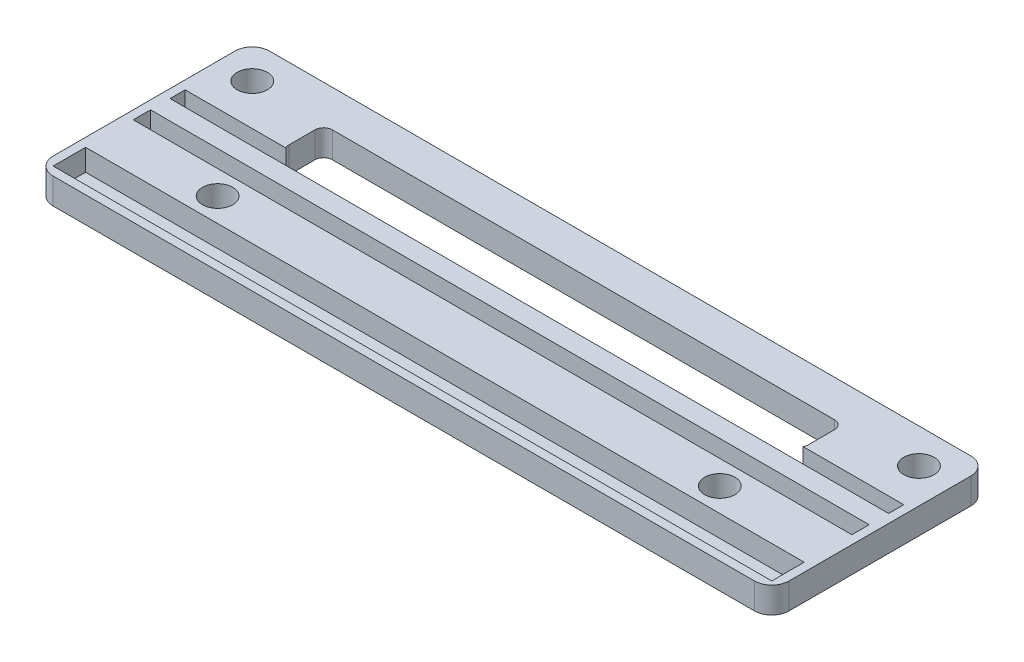
ISO-10303-21;
HEADER;
FILE_DESCRIPTION(('STEP AP214'),'2;1');
FILE_NAME('part.step','',(''),(''),'','','');
FILE_SCHEMA(('AUTOMOTIVE_DESIGN { 1 0 10303 214 1 1 1 1 }'));
ENDSEC;
DATA;
#1=APPLICATION_CONTEXT('core data for automotive mechanical design processes');
#2=APPLICATION_PROTOCOL_DEFINITION('international standard','automotive_design',2000,#1);
#3=PRODUCT_CONTEXT('',#1,'mechanical');
#4=PRODUCT('Part','Part','',(#3));
#5=PRODUCT_RELATED_PRODUCT_CATEGORY('part','',(#4));
#6=PRODUCT_DEFINITION_FORMATION('','',#4);
#7=PRODUCT_DEFINITION_CONTEXT('part definition',#1,'design');
#8=PRODUCT_DEFINITION('design','',#6,#7);
#9=PRODUCT_DEFINITION_SHAPE('','',#8);
#10=(LENGTH_UNIT() NAMED_UNIT(*) SI_UNIT(.MILLI.,.METRE.));
#11=(NAMED_UNIT(*) PLANE_ANGLE_UNIT() SI_UNIT($,.RADIAN.));
#12=(NAMED_UNIT(*) SI_UNIT($,.STERADIAN.) SOLID_ANGLE_UNIT());
#13=UNCERTAINTY_MEASURE_WITH_UNIT(LENGTH_MEASURE(1.E-05),#10,'distance_accuracy_value','');
#14=(GEOMETRIC_REPRESENTATION_CONTEXT(3) GLOBAL_UNCERTAINTY_ASSIGNED_CONTEXT((#13)) GLOBAL_UNIT_ASSIGNED_CONTEXT((#10,
#11,#12)) REPRESENTATION_CONTEXT('',''));
#15=CARTESIAN_POINT('',(0.,0.,0.));
#16=DIRECTION('',(0.,0.,1.));
#17=DIRECTION('',(1.,0.,0.));
#18=AXIS2_PLACEMENT_3D('',#15,#16,#17);
#19=CARTESIAN_POINT('',(-41.5,0.5,-3.75));
#20=DIRECTION('',(0.,0.,-1.));
#21=DIRECTION('',(-1.,0.,0.));
#22=AXIS2_PLACEMENT_3D('',#19,#20,#21);
#23=PLANE('',#22);
#24=DIRECTION('',(-1.,0.,0.));
#25=VECTOR('',#24,1.);
#26=CARTESIAN_POINT('',(-41.5,0.5,-3.75));
#27=LINE('',#26,#25);
#28=CARTESIAN_POINT('',(-29.8660254037844,0.5,-3.75));
#29=VERTEX_POINT('',#28);
#30=CARTESIAN_POINT('',(-41.5,0.5,-3.75));
#31=VERTEX_POINT('',#30);
#32=EDGE_CURVE('E353',#29,#31,#27,.T.);
#33=ORIENTED_EDGE('',*,*,#32,.F.);
#34=DIRECTION('',(0.,-1.,0.));
#35=VECTOR('',#34,1.);
#36=CARTESIAN_POINT('',(-29.8660254037844,0.5,-3.75));
#37=LINE('',#36,#35);
#38=CARTESIAN_POINT('',(-29.8660254037844,3.,-3.75));
#39=VERTEX_POINT('',#38);
#40=EDGE_CURVE('E475',#29,#39,#37,.F.);
#41=ORIENTED_EDGE('',*,*,#40,.T.);
#42=DIRECTION('',(-1.,0.,0.));
#43=VECTOR('',#42,1.);
#44=CARTESIAN_POINT('',(-41.5,3.,-3.75));
#45=LINE('',#44,#43);
#46=CARTESIAN_POINT('',(-41.5,3.,-3.75));
#47=VERTEX_POINT('',#46);
#48=EDGE_CURVE('E370',#39,#47,#45,.T.);
#49=ORIENTED_EDGE('',*,*,#48,.T.);
#50=DIRECTION('',(0.,1.,0.));
#51=VECTOR('',#50,1.);
#52=CARTESIAN_POINT('',(-41.5,0.5,-3.75));
#53=LINE('',#52,#51);
#54=EDGE_CURVE('E318',#31,#47,#53,.T.);
#55=ORIENTED_EDGE('',*,*,#54,.F.);
#56=EDGE_LOOP('',(#33,#41,#49,#55));
#57=FACE_BOUND('',#56,.T.);
#58=ADVANCED_FACE('F38',(#57),#23,.F.);
#59=CARTESIAN_POINT('',(-42.5,3.,-12.5));
#60=DIRECTION('',(1.,0.,0.));
#61=DIRECTION('',(0.,0.,-1.));
#62=AXIS2_PLACEMENT_3D('',#59,#60,#61);
#63=PLANE('',#62);
#64=DIRECTION('',(0.,0.,1.));
#65=VECTOR('',#64,1.);
#66=CARTESIAN_POINT('',(-42.5,0.,-12.5));
#67=LINE('',#66,#65);
#68=CARTESIAN_POINT('',(-42.5,0.,-10.5));
#69=VERTEX_POINT('',#68);
#70=CARTESIAN_POINT('',(-42.5,0.,10.5));
#71=VERTEX_POINT('',#70);
#72=EDGE_CURVE('E290',#69,#71,#67,.T.);
#73=ORIENTED_EDGE('',*,*,#72,.T.);
#74=DIRECTION('',(0.,-1.,0.));
#75=VECTOR('',#74,1.);
#76=CARTESIAN_POINT('',(-42.5,3.,10.5));
#77=LINE('',#76,#75);
#78=CARTESIAN_POINT('',(-42.5,3.,10.5));
#79=VERTEX_POINT('',#78);
#80=EDGE_CURVE('E11',#71,#79,#77,.F.);
#81=ORIENTED_EDGE('',*,*,#80,.T.);
#82=DIRECTION('',(0.,0.,1.));
#83=VECTOR('',#82,1.);
#84=CARTESIAN_POINT('',(-42.5,3.,-12.5));
#85=LINE('',#84,#83);
#86=CARTESIAN_POINT('',(-42.5,3.,-10.5));
#87=VERTEX_POINT('',#86);
#88=EDGE_CURVE('E385',#87,#79,#85,.T.);
#89=ORIENTED_EDGE('',*,*,#88,.F.);
#90=DIRECTION('',(0.,-1.,0.));
#91=VECTOR('',#90,1.);
#92=CARTESIAN_POINT('',(-42.5,3.,-10.5));
#93=LINE('',#92,#91);
#94=EDGE_CURVE('E47',#87,#69,#93,.T.);
#95=ORIENTED_EDGE('',*,*,#94,.T.);
#96=EDGE_LOOP('',(#73,#81,#89,#95));
#97=FACE_BOUND('',#96,.T.);
#98=ADVANCED_FACE('F533',(#97),#63,.F.);
#99=CARTESIAN_POINT('',(-42.5,3.,12.5));
#100=DIRECTION('',(0.,0.,-1.));
#101=DIRECTION('',(-1.,0.,0.));
#102=AXIS2_PLACEMENT_3D('',#99,#100,#101);
#103=PLANE('',#102);
#104=DIRECTION('',(1.,0.,0.));
#105=VECTOR('',#104,1.);
#106=CARTESIAN_POINT('',(-42.5,0.,12.5));
#107=LINE('',#106,#105);
#108=CARTESIAN_POINT('',(-40.5,0.,12.5));
#109=VERTEX_POINT('',#108);
#110=CARTESIAN_POINT('',(40.5,0.,12.5));
#111=VERTEX_POINT('',#110);
#112=EDGE_CURVE('E404',#109,#111,#107,.T.);
#113=ORIENTED_EDGE('',*,*,#112,.T.);
#114=DIRECTION('',(0.,-1.,0.));
#115=VECTOR('',#114,1.);
#116=CARTESIAN_POINT('',(40.5,3.,12.5));
#117=LINE('',#116,#115);
#118=CARTESIAN_POINT('',(40.5,3.,12.5));
#119=VERTEX_POINT('',#118);
#120=EDGE_CURVE('E54',#111,#119,#117,.F.);
#121=ORIENTED_EDGE('',*,*,#120,.T.);
#122=DIRECTION('',(1.,0.,0.));
#123=VECTOR('',#122,1.);
#124=CARTESIAN_POINT('',(-42.5,3.,12.5));
#125=LINE('',#124,#123);
#126=CARTESIAN_POINT('',(-40.5,3.,12.5));
#127=VERTEX_POINT('',#126);
#128=EDGE_CURVE('E388',#127,#119,#125,.T.);
#129=ORIENTED_EDGE('',*,*,#128,.F.);
#130=DIRECTION('',(0.,-1.,0.));
#131=VECTOR('',#130,1.);
#132=CARTESIAN_POINT('',(-40.5,3.,12.5));
#133=LINE('',#132,#131);
#134=EDGE_CURVE('E522',#127,#109,#133,.T.);
#135=ORIENTED_EDGE('',*,*,#134,.T.);
#136=EDGE_LOOP('',(#113,#121,#129,#135));
#137=FACE_BOUND('',#136,.T.);
#138=ADVANCED_FACE('F544',(#137),#103,.F.);
#139=CARTESIAN_POINT('',(42.5,3.,-12.5));
#140=DIRECTION('',(-1.,0.,0.));
#141=DIRECTION('',(0.,0.,1.));
#142=AXIS2_PLACEMENT_3D('',#139,#140,#141);
#143=PLANE('',#142);
#144=DIRECTION('',(0.,0.,-1.));
#145=VECTOR('',#144,1.);
#146=CARTESIAN_POINT('',(42.5,0.,-12.5));
#147=LINE('',#146,#145);
#148=CARTESIAN_POINT('',(42.5,0.,10.5));
#149=VERTEX_POINT('',#148);
#150=CARTESIAN_POINT('',(42.5,0.,-10.5));
#151=VERTEX_POINT('',#150);
#152=EDGE_CURVE('E407',#149,#151,#147,.T.);
#153=ORIENTED_EDGE('',*,*,#152,.T.);
#154=DIRECTION('',(0.,-1.,0.));
#155=VECTOR('',#154,1.);
#156=CARTESIAN_POINT('',(42.5,3.,-10.5));
#157=LINE('',#156,#155);
#158=CARTESIAN_POINT('',(42.5,3.,-10.5));
#159=VERTEX_POINT('',#158);
#160=EDGE_CURVE('E508',#151,#159,#157,.F.);
#161=ORIENTED_EDGE('',*,*,#160,.T.);
#162=DIRECTION('',(0.,0.,-1.));
#163=VECTOR('',#162,1.);
#164=CARTESIAN_POINT('',(42.5,3.,-12.5));
#165=LINE('',#164,#163);
#166=CARTESIAN_POINT('',(42.5,3.,10.5));
#167=VERTEX_POINT('',#166);
#168=EDGE_CURVE('E392',#167,#159,#165,.T.);
#169=ORIENTED_EDGE('',*,*,#168,.F.);
#170=DIRECTION('',(0.,-1.,0.));
#171=VECTOR('',#170,1.);
#172=CARTESIAN_POINT('',(42.5,3.,10.5));
#173=LINE('',#172,#171);
#174=EDGE_CURVE('E504',#167,#149,#173,.T.);
#175=ORIENTED_EDGE('',*,*,#174,.T.);
#176=EDGE_LOOP('',(#153,#161,#169,#175));
#177=FACE_BOUND('',#176,.T.);
#178=ADVANCED_FACE('F553',(#177),#143,.F.);
#179=CARTESIAN_POINT('',(-42.5,3.,-12.5));
#180=DIRECTION('',(0.,0.,1.));
#181=DIRECTION('',(1.,0.,0.));
#182=AXIS2_PLACEMENT_3D('',#179,#180,#181);
#183=PLANE('',#182);
#184=DIRECTION('',(-1.,0.,0.));
#185=VECTOR('',#184,1.);
#186=CARTESIAN_POINT('',(-42.5,3.,-12.5));
#187=LINE('',#186,#185);
#188=CARTESIAN_POINT('',(40.5,3.,-12.5));
#189=VERTEX_POINT('',#188);
#190=CARTESIAN_POINT('',(-40.5,3.,-12.5));
#191=VERTEX_POINT('',#190);
#192=EDGE_CURVE('E396',#189,#191,#187,.T.);
#193=ORIENTED_EDGE('',*,*,#192,.F.);
#194=DIRECTION('',(0.,-1.,0.));
#195=VECTOR('',#194,1.);
#196=CARTESIAN_POINT('',(40.5,3.,-12.5));
#197=LINE('',#196,#195);
#198=CARTESIAN_POINT('',(40.5,0.,-12.5));
#199=VERTEX_POINT('',#198);
#200=EDGE_CURVE('E488',#189,#199,#197,.T.);
#201=ORIENTED_EDGE('',*,*,#200,.T.);
#202=DIRECTION('',(-1.,0.,0.));
#203=VECTOR('',#202,1.);
#204=CARTESIAN_POINT('',(-42.5,0.,-12.5));
#205=LINE('',#204,#203);
#206=CARTESIAN_POINT('',(-40.5,0.,-12.5));
#207=VERTEX_POINT('',#206);
#208=EDGE_CURVE('E389',#199,#207,#205,.T.);
#209=ORIENTED_EDGE('',*,*,#208,.T.);
#210=DIRECTION('',(0.,-1.,0.));
#211=VECTOR('',#210,1.);
#212=CARTESIAN_POINT('',(-40.5,3.,-12.5));
#213=LINE('',#212,#211);
#214=EDGE_CURVE('E485',#207,#191,#213,.F.);
#215=ORIENTED_EDGE('',*,*,#214,.T.);
#216=EDGE_LOOP('',(#193,#201,#209,#215));
#217=FACE_BOUND('',#216,.T.);
#218=ADVANCED_FACE('F561',(#217),#183,.F.);
#219=CARTESIAN_POINT('',(0.,3.,0.));
#220=DIRECTION('',(0.,1.,0.));
#221=DIRECTION('',(0.,0.,1.));
#222=AXIS2_PLACEMENT_3D('',#219,#220,#221);
#223=PLANE('',#222);
#224=DIRECTION('',(0.,0.,1.));
#225=VECTOR('',#224,1.);
#226=CARTESIAN_POINT('',(-30.,3.,-8.25000000000003));
#227=LINE('',#226,#225);
#228=CARTESIAN_POINT('',(-30.,3.,-7.25000000000003));
#229=VERTEX_POINT('',#228);
#230=CARTESIAN_POINT('',(-30.,3.,-4.25000000000001));
#231=VERTEX_POINT('',#230);
#232=EDGE_CURVE('E638',#229,#231,#227,.T.);
#233=ORIENTED_EDGE('',*,*,#232,.F.);
#234=CARTESIAN_POINT('',(-29.,3.,-7.25000000000003));
#235=DIRECTION('',(0.,1.,0.));
#236=DIRECTION('',(0.,0.,1.));
#237=AXIS2_PLACEMENT_3D('',#234,#235,#236);
#238=CIRCLE('',#237,1.);
#239=CARTESIAN_POINT('',(-29.,3.,-8.25000000000003));
#240=VERTEX_POINT('',#239);
#241=EDGE_CURVE('E465',#229,#240,#238,.F.);
#242=ORIENTED_EDGE('',*,*,#241,.T.);
#243=DIRECTION('',(-1.,0.,0.));
#244=VECTOR('',#243,1.);
#245=CARTESIAN_POINT('',(-30.,3.,-8.25000000000003));
#246=LINE('',#245,#244);
#247=CARTESIAN_POINT('',(29.,3.,-8.25000000000003));
#248=VERTEX_POINT('',#247);
#249=EDGE_CURVE('E645',#248,#240,#246,.T.);
#250=ORIENTED_EDGE('',*,*,#249,.F.);
#251=CARTESIAN_POINT('',(29.,3.,-7.25000000000003));
#252=DIRECTION('',(0.,1.,0.));
#253=DIRECTION('',(0.,0.,1.));
#254=AXIS2_PLACEMENT_3D('',#251,#252,#253);
#255=CIRCLE('',#254,1.);
#256=CARTESIAN_POINT('',(30.,3.,-7.25000000000003));
#257=VERTEX_POINT('',#256);
#258=EDGE_CURVE('E459',#248,#257,#255,.F.);
#259=ORIENTED_EDGE('',*,*,#258,.T.);
#260=DIRECTION('',(0.,0.,-1.));
#261=VECTOR('',#260,1.);
#262=CARTESIAN_POINT('',(30.,3.,-8.25000000000003));
#263=LINE('',#262,#261);
#264=CARTESIAN_POINT('',(30.,3.,-4.25000000000003));
#265=VERTEX_POINT('',#264);
#266=EDGE_CURVE('E601',#265,#257,#263,.T.);
#267=ORIENTED_EDGE('',*,*,#266,.F.);
#268=CARTESIAN_POINT('',(29.,3.,-4.25000000000003));
#269=DIRECTION('',(0.,1.,0.));
#270=DIRECTION('',(0.,0.,1.));
#271=AXIS2_PLACEMENT_3D('',#268,#269,#270);
#272=CIRCLE('',#271,1.);
#273=CARTESIAN_POINT('',(29.8660254037844,3.,-3.75000000000001));
#274=VERTEX_POINT('',#273);
#275=EDGE_CURVE('E445',#265,#274,#272,.F.);
#276=ORIENTED_EDGE('',*,*,#275,.T.);
#277=CARTESIAN_POINT('',(41.5,3.,-3.75000000000001));
#278=VERTEX_POINT('',#277);
#279=EDGE_CURVE('E345',#278,#274,#45,.T.);
#280=ORIENTED_EDGE('',*,*,#279,.F.);
#281=DIRECTION('',(0.,0.,-1.));
#282=VECTOR('',#281,1.);
#283=CARTESIAN_POINT('',(41.5,3.,-3.75000000000001));
#284=LINE('',#283,#282);
#285=CARTESIAN_POINT('',(41.5,3.,-2.00000000000001));
#286=VERTEX_POINT('',#285);
#287=EDGE_CURVE('E366',#286,#278,#284,.T.);
#288=ORIENTED_EDGE('',*,*,#287,.F.);
#289=DIRECTION('',(1.,0.,0.));
#290=VECTOR('',#289,1.);
#291=CARTESIAN_POINT('',(-41.5,3.,-2.));
#292=LINE('',#291,#290);
#293=CARTESIAN_POINT('',(-41.5,3.,-2.));
#294=VERTEX_POINT('',#293);
#295=EDGE_CURVE('E361',#294,#286,#292,.T.);
#296=ORIENTED_EDGE('',*,*,#295,.F.);
#297=DIRECTION('',(0.,0.,1.));
#298=VECTOR('',#297,1.);
#299=CARTESIAN_POINT('',(-41.5,3.,-3.75));
#300=LINE('',#299,#298);
#301=EDGE_CURVE('E358',#47,#294,#300,.T.);
#302=ORIENTED_EDGE('',*,*,#301,.F.);
#303=ORIENTED_EDGE('',*,*,#48,.F.);
#304=CARTESIAN_POINT('',(-29.,3.,-4.25000000000001));
#305=DIRECTION('',(0.,1.,0.));
#306=DIRECTION('',(0.,0.,1.));
#307=AXIS2_PLACEMENT_3D('',#304,#305,#306);
#308=CIRCLE('',#307,1.);
#309=EDGE_CURVE('E479',#39,#231,#308,.F.);
#310=ORIENTED_EDGE('',*,*,#309,.T.);
#311=EDGE_LOOP('',(#233,#242,#250,#259,#267,#276,#280,#288,#296,#302,#303,#310));
#312=FACE_BOUND('',#311,.T.);
#313=CARTESIAN_POINT('',(-38.5,3.,-8.49999999999996));
#314=DIRECTION('',(0.,1.,0.));
#315=DIRECTION('',(0.,0.,1.));
#316=AXIS2_PLACEMENT_3D('',#313,#314,#315);
#317=CIRCLE('',#316,1.75);
#318=CARTESIAN_POINT('',(-38.5,3.,-6.74999999999996));
#319=VERTEX_POINT('',#318);
#320=EDGE_CURVE('E667',#319,#319,#317,.T.);
#321=ORIENTED_EDGE('',*,*,#320,.F.);
#322=EDGE_LOOP('',(#321));
#323=FACE_BOUND('',#322,.T.);
#324=CARTESIAN_POINT('',(28.9999999999999,3.,4.99999999999999));
#325=DIRECTION('',(0.,1.,0.));
#326=DIRECTION('',(0.,0.,-1.));
#327=AXIS2_PLACEMENT_3D('',#324,#325,#326);
#328=CIRCLE('',#327,1.75);
#329=CARTESIAN_POINT('',(28.9999999999999,3.,3.25));
#330=VERTEX_POINT('',#329);
#331=EDGE_CURVE('E659',#330,#330,#328,.T.);
#332=ORIENTED_EDGE('',*,*,#331,.F.);
#333=EDGE_LOOP('',(#332));
#334=FACE_BOUND('',#333,.T.);
#335=CARTESIAN_POINT('',(-29.,3.,4.99999999999999));
#336=DIRECTION('',(0.,1.,0.));
#337=DIRECTION('',(0.,0.,1.));
#338=AXIS2_PLACEMENT_3D('',#335,#336,#337);
#339=CIRCLE('',#338,1.75);
#340=CARTESIAN_POINT('',(-29.,3.,6.74999999999999));
#341=VERTEX_POINT('',#340);
#342=EDGE_CURVE('E271',#341,#341,#339,.T.);
#343=ORIENTED_EDGE('',*,*,#342,.F.);
#344=EDGE_LOOP('',(#343));
#345=FACE_BOUND('',#344,.T.);
#346=CARTESIAN_POINT('',(38.5,3.,-8.49999999999996));
#347=DIRECTION('',(0.,1.,0.));
#348=DIRECTION('',(0.,0.,-1.));
#349=AXIS2_PLACEMENT_3D('',#346,#347,#348);
#350=CIRCLE('',#349,1.75);
#351=CARTESIAN_POINT('',(38.5,3.,-10.25));
#352=VERTEX_POINT('',#351);
#353=EDGE_CURVE('E682',#352,#352,#350,.T.);
#354=ORIENTED_EDGE('',*,*,#353,.F.);
#355=EDGE_LOOP('',(#354));
#356=FACE_BOUND('',#355,.T.);
#357=DIRECTION('',(0.,0.,1.));
#358=VECTOR('',#357,1.);
#359=CARTESIAN_POINT('',(-41.5,3.,7.75));
#360=LINE('',#359,#358);
#361=CARTESIAN_POINT('',(-41.5,3.,7.75));
#362=VERTEX_POINT('',#361);
#363=CARTESIAN_POINT('',(-41.5,3.,11.5));
#364=VERTEX_POINT('',#363);
#365=EDGE_CURVE('E244',#362,#364,#360,.T.);
#366=ORIENTED_EDGE('',*,*,#365,.F.);
#367=DIRECTION('',(-1.,0.,0.));
#368=VECTOR('',#367,1.);
#369=CARTESIAN_POINT('',(-41.5,3.,7.75));
#370=LINE('',#369,#368);
#371=CARTESIAN_POINT('',(41.5,3.,7.74999999999999));
#372=VERTEX_POINT('',#371);
#373=EDGE_CURVE('E264',#372,#362,#370,.T.);
#374=ORIENTED_EDGE('',*,*,#373,.F.);
#375=DIRECTION('',(0.,0.,-1.));
#376=VECTOR('',#375,1.);
#377=CARTESIAN_POINT('',(41.5,3.,7.74999999999999));
#378=LINE('',#377,#376);
#379=CARTESIAN_POINT('',(41.5,3.,11.5));
#380=VERTEX_POINT('',#379);
#381=EDGE_CURVE('E268',#380,#372,#378,.T.);
#382=ORIENTED_EDGE('',*,*,#381,.F.);
#383=DIRECTION('',(1.,0.,0.));
#384=VECTOR('',#383,1.);
#385=CARTESIAN_POINT('',(-41.5,3.,11.5));
#386=LINE('',#385,#384);
#387=EDGE_CURVE('E280',#364,#380,#386,.T.);
#388=ORIENTED_EDGE('',*,*,#387,.F.);
#389=EDGE_LOOP('',(#366,#374,#382,#388));
#390=FACE_BOUND('',#389,.T.);
#391=DIRECTION('',(0.,0.,1.));
#392=VECTOR('',#391,1.);
#393=CARTESIAN_POINT('',(-41.5,3.,0.25));
#394=LINE('',#393,#392);
#395=CARTESIAN_POINT('',(-41.5,3.,0.25));
#396=VERTEX_POINT('',#395);
#397=CARTESIAN_POINT('',(-41.5,3.,2.25));
#398=VERTEX_POINT('',#397);
#399=EDGE_CURVE('E314',#396,#398,#394,.T.);
#400=ORIENTED_EDGE('',*,*,#399,.F.);
#401=DIRECTION('',(-1.,0.,0.));
#402=VECTOR('',#401,1.);
#403=CARTESIAN_POINT('',(-41.5,3.,0.25));
#404=LINE('',#403,#402);
#405=CARTESIAN_POINT('',(41.5,3.,0.24999999999999));
#406=VERTEX_POINT('',#405);
#407=EDGE_CURVE('E301',#406,#396,#404,.T.);
#408=ORIENTED_EDGE('',*,*,#407,.F.);
#409=DIRECTION('',(0.,0.,-1.));
#410=VECTOR('',#409,1.);
#411=CARTESIAN_POINT('',(41.5,3.,0.24999999999999));
#412=LINE('',#411,#410);
#413=CARTESIAN_POINT('',(41.5,3.,2.24999999999999));
#414=VERTEX_POINT('',#413);
#415=EDGE_CURVE('E322',#414,#406,#412,.T.);
#416=ORIENTED_EDGE('',*,*,#415,.F.);
#417=DIRECTION('',(1.,0.,0.));
#418=VECTOR('',#417,1.);
#419=CARTESIAN_POINT('',(-41.5,3.,2.25));
#420=LINE('',#419,#418);
#421=EDGE_CURVE('E317',#398,#414,#420,.T.);
#422=ORIENTED_EDGE('',*,*,#421,.F.);
#423=EDGE_LOOP('',(#400,#408,#416,#422));
#424=FACE_BOUND('',#423,.T.);
#425=ORIENTED_EDGE('',*,*,#168,.T.);
#426=CARTESIAN_POINT('',(40.5,3.,-10.5));
#427=DIRECTION('',(0.,1.,0.));
#428=DIRECTION('',(0.,0.,1.));
#429=AXIS2_PLACEMENT_3D('',#426,#427,#428);
#430=CIRCLE('',#429,2.);
#431=EDGE_CURVE('E519',#159,#189,#430,.T.);
#432=ORIENTED_EDGE('',*,*,#431,.T.);
#433=ORIENTED_EDGE('',*,*,#192,.T.);
#434=CARTESIAN_POINT('',(-40.5,3.,-10.5));
#435=DIRECTION('',(0.,1.,0.));
#436=DIRECTION('',(0.,0.,1.));
#437=AXIS2_PLACEMENT_3D('',#434,#435,#436);
#438=CIRCLE('',#437,2.);
#439=EDGE_CURVE('E511',#191,#87,#438,.T.);
#440=ORIENTED_EDGE('',*,*,#439,.T.);
#441=ORIENTED_EDGE('',*,*,#88,.T.);
#442=CARTESIAN_POINT('',(-40.5,3.,10.5));
#443=DIRECTION('',(0.,1.,0.));
#444=DIRECTION('',(0.,0.,1.));
#445=AXIS2_PLACEMENT_3D('',#442,#443,#444);
#446=CIRCLE('',#445,2.);
#447=EDGE_CURVE('E61',#79,#127,#446,.T.);
#448=ORIENTED_EDGE('',*,*,#447,.T.);
#449=ORIENTED_EDGE('',*,*,#128,.T.);
#450=CARTESIAN_POINT('',(40.5,3.,10.5));
#451=DIRECTION('',(0.,1.,0.));
#452=DIRECTION('',(0.,0.,1.));
#453=AXIS2_PLACEMENT_3D('',#450,#451,#452);
#454=CIRCLE('',#453,2.);
#455=EDGE_CURVE('E516',#119,#167,#454,.T.);
#456=ORIENTED_EDGE('',*,*,#455,.T.);
#457=EDGE_LOOP('',(#425,#432,#433,#440,#441,#448,#449,#456));
#458=FACE_BOUND('',#457,.T.);
#459=ADVANCED_FACE('F546',(#312,#323,#334,#345,#356,#390,#424,#458),#223,.T.);
#460=CARTESIAN_POINT('',(0.,0.,0.));
#461=DIRECTION('',(0.,1.,0.));
#462=DIRECTION('',(0.,0.,1.));
#463=AXIS2_PLACEMENT_3D('',#460,#461,#462);
#464=PLANE('',#463);
#465=DIRECTION('',(0.,0.,-1.));
#466=VECTOR('',#465,1.);
#467=CARTESIAN_POINT('',(30.,0.,-8.25000000000003));
#468=LINE('',#467,#466);
#469=CARTESIAN_POINT('',(30.,0.,-4.25000000000003));
#470=VERTEX_POINT('',#469);
#471=CARTESIAN_POINT('',(30.,0.,-7.25000000000003));
#472=VERTEX_POINT('',#471);
#473=EDGE_CURVE('E649',#470,#472,#468,.T.);
#474=ORIENTED_EDGE('',*,*,#473,.T.);
#475=CARTESIAN_POINT('',(29.,0.,-7.25000000000003));
#476=DIRECTION('',(0.,1.,0.));
#477=DIRECTION('',(0.,0.,1.));
#478=AXIS2_PLACEMENT_3D('',#475,#476,#477);
#479=CIRCLE('',#478,1.);
#480=CARTESIAN_POINT('',(29.,0.,-8.25000000000003));
#481=VERTEX_POINT('',#480);
#482=EDGE_CURVE('E462',#472,#481,#479,.T.);
#483=ORIENTED_EDGE('',*,*,#482,.T.);
#484=DIRECTION('',(-1.,0.,0.));
#485=VECTOR('',#484,1.);
#486=CARTESIAN_POINT('',(-30.,0.,-8.25000000000003));
#487=LINE('',#486,#485);
#488=CARTESIAN_POINT('',(-29.,0.,-8.25000000000003));
#489=VERTEX_POINT('',#488);
#490=EDGE_CURVE('E656',#481,#489,#487,.T.);
#491=ORIENTED_EDGE('',*,*,#490,.T.);
#492=CARTESIAN_POINT('',(-29.,0.,-7.25000000000003));
#493=DIRECTION('',(0.,1.,0.));
#494=DIRECTION('',(0.,0.,1.));
#495=AXIS2_PLACEMENT_3D('',#492,#493,#494);
#496=CIRCLE('',#495,1.);
#497=CARTESIAN_POINT('',(-30.,0.,-7.25000000000003));
#498=VERTEX_POINT('',#497);
#499=EDGE_CURVE('E468',#489,#498,#496,.T.);
#500=ORIENTED_EDGE('',*,*,#499,.T.);
#501=DIRECTION('',(0.,0.,1.));
#502=VECTOR('',#501,1.);
#503=CARTESIAN_POINT('',(-30.,0.,-8.25000000000003));
#504=LINE('',#503,#502);
#505=CARTESIAN_POINT('',(-30.,0.,-4.25000000000001));
#506=VERTEX_POINT('',#505);
#507=EDGE_CURVE('E636',#498,#506,#504,.T.);
#508=ORIENTED_EDGE('',*,*,#507,.T.);
#509=CARTESIAN_POINT('',(-29.,0.,-4.25000000000001));
#510=DIRECTION('',(0.,1.,0.));
#511=DIRECTION('',(0.,0.,1.));
#512=AXIS2_PLACEMENT_3D('',#509,#510,#511);
#513=CIRCLE('',#512,1.);
#514=CARTESIAN_POINT('',(-29.,0.,-3.25000000000001));
#515=VERTEX_POINT('',#514);
#516=EDGE_CURVE('E482',#506,#515,#513,.T.);
#517=ORIENTED_EDGE('',*,*,#516,.T.);
#518=DIRECTION('',(1.,0.,0.));
#519=VECTOR('',#518,1.);
#520=CARTESIAN_POINT('',(-30.,0.,-3.25000000000001));
#521=LINE('',#520,#519);
#522=CARTESIAN_POINT('',(29.,0.,-3.25000000000003));
#523=VERTEX_POINT('',#522);
#524=EDGE_CURVE('E615',#515,#523,#521,.T.);
#525=ORIENTED_EDGE('',*,*,#524,.T.);
#526=CARTESIAN_POINT('',(29.,0.,-4.25000000000003));
#527=DIRECTION('',(0.,1.,0.));
#528=DIRECTION('',(0.,0.,1.));
#529=AXIS2_PLACEMENT_3D('',#526,#527,#528);
#530=CIRCLE('',#529,1.);
#531=EDGE_CURVE('E456',#523,#470,#530,.T.);
#532=ORIENTED_EDGE('',*,*,#531,.T.);
#533=EDGE_LOOP('',(#474,#483,#491,#500,#508,#517,#525,#532));
#534=FACE_BOUND('',#533,.T.);
#535=CARTESIAN_POINT('',(-38.5,0.,-8.49999999999996));
#536=DIRECTION('',(0.,1.,0.));
#537=DIRECTION('',(0.,0.,1.));
#538=AXIS2_PLACEMENT_3D('',#535,#536,#537);
#539=CIRCLE('',#538,1.75);
#540=CARTESIAN_POINT('',(-38.5,0.,-6.74999999999996));
#541=VERTEX_POINT('',#540);
#542=EDGE_CURVE('E362',#541,#541,#539,.T.);
#543=ORIENTED_EDGE('',*,*,#542,.T.);
#544=EDGE_LOOP('',(#543));
#545=FACE_BOUND('',#544,.T.);
#546=CARTESIAN_POINT('',(28.9999999999999,0.,4.99999999999999));
#547=DIRECTION('',(0.,1.,0.));
#548=DIRECTION('',(0.,0.,-1.));
#549=AXIS2_PLACEMENT_3D('',#546,#547,#548);
#550=CIRCLE('',#549,1.75);
#551=CARTESIAN_POINT('',(28.9999999999999,0.,3.25));
#552=VERTEX_POINT('',#551);
#553=EDGE_CURVE('E672',#552,#552,#550,.T.);
#554=ORIENTED_EDGE('',*,*,#553,.T.);
#555=EDGE_LOOP('',(#554));
#556=FACE_BOUND('',#555,.T.);
#557=CARTESIAN_POINT('',(-29.,0.,4.99999999999999));
#558=DIRECTION('',(0.,1.,0.));
#559=DIRECTION('',(0.,0.,1.));
#560=AXIS2_PLACEMENT_3D('',#557,#558,#559);
#561=CIRCLE('',#560,1.75);
#562=CARTESIAN_POINT('',(-29.,0.,6.74999999999999));
#563=VERTEX_POINT('',#562);
#564=EDGE_CURVE('E685',#563,#563,#561,.T.);
#565=ORIENTED_EDGE('',*,*,#564,.T.);
#566=EDGE_LOOP('',(#565));
#567=FACE_BOUND('',#566,.T.);
#568=CARTESIAN_POINT('',(38.5,0.,-8.49999999999996));
#569=DIRECTION('',(0.,1.,0.));
#570=DIRECTION('',(0.,0.,-1.));
#571=AXIS2_PLACEMENT_3D('',#568,#569,#570);
#572=CIRCLE('',#571,1.75);
#573=CARTESIAN_POINT('',(38.5,0.,-10.25));
#574=VERTEX_POINT('',#573);
#575=EDGE_CURVE('E671',#574,#574,#572,.T.);
#576=ORIENTED_EDGE('',*,*,#575,.T.);
#577=EDGE_LOOP('',(#576));
#578=FACE_BOUND('',#577,.T.);
#579=ORIENTED_EDGE('',*,*,#208,.F.);
#580=CARTESIAN_POINT('',(40.5,0.,-10.5));
#581=DIRECTION('',(0.,1.,0.));
#582=DIRECTION('',(0.,0.,1.));
#583=AXIS2_PLACEMENT_3D('',#580,#581,#582);
#584=CIRCLE('',#583,2.);
#585=EDGE_CURVE('E501',#199,#151,#584,.F.);
#586=ORIENTED_EDGE('',*,*,#585,.T.);
#587=ORIENTED_EDGE('',*,*,#152,.F.);
#588=CARTESIAN_POINT('',(40.5,0.,10.5));
#589=DIRECTION('',(0.,1.,0.));
#590=DIRECTION('',(0.,0.,1.));
#591=AXIS2_PLACEMENT_3D('',#588,#589,#590);
#592=CIRCLE('',#591,2.);
#593=EDGE_CURVE('E498',#149,#111,#592,.F.);
#594=ORIENTED_EDGE('',*,*,#593,.T.);
#595=ORIENTED_EDGE('',*,*,#112,.F.);
#596=CARTESIAN_POINT('',(-40.5,0.,10.5));
#597=DIRECTION('',(0.,1.,0.));
#598=DIRECTION('',(0.,0.,1.));
#599=AXIS2_PLACEMENT_3D('',#596,#597,#598);
#600=CIRCLE('',#599,2.);
#601=EDGE_CURVE('E495',#109,#71,#600,.F.);
#602=ORIENTED_EDGE('',*,*,#601,.T.);
#603=ORIENTED_EDGE('',*,*,#72,.F.);
#604=CARTESIAN_POINT('',(-40.5,0.,-10.5));
#605=DIRECTION('',(0.,1.,0.));
#606=DIRECTION('',(0.,0.,1.));
#607=AXIS2_PLACEMENT_3D('',#604,#605,#606);
#608=CIRCLE('',#607,2.);
#609=EDGE_CURVE('E492',#69,#207,#608,.F.);
#610=ORIENTED_EDGE('',*,*,#609,.T.);
#611=EDGE_LOOP('',(#579,#586,#587,#594,#595,#602,#603,#610));
#612=FACE_BOUND('',#611,.T.);
#613=ADVANCED_FACE('F539',(#534,#545,#556,#567,#578,#612),#464,.F.);
#614=CARTESIAN_POINT('',(-41.5,0.5,-3.75));
#615=DIRECTION('',(-1.,0.,0.));
#616=DIRECTION('',(0.,0.,1.));
#617=AXIS2_PLACEMENT_3D('',#614,#615,#616);
#618=PLANE('',#617);
#619=ORIENTED_EDGE('',*,*,#301,.T.);
#620=DIRECTION('',(0.,1.,0.));
#621=VECTOR('',#620,1.);
#622=CARTESIAN_POINT('',(-41.5,0.5,-2.));
#623=LINE('',#622,#621);
#624=CARTESIAN_POINT('',(-41.5,0.5,-2.));
#625=VERTEX_POINT('',#624);
#626=EDGE_CURVE('E357',#625,#294,#623,.T.);
#627=ORIENTED_EDGE('',*,*,#626,.F.);
#628=DIRECTION('',(0.,0.,1.));
#629=VECTOR('',#628,1.);
#630=CARTESIAN_POINT('',(-41.5,0.5,-3.75));
#631=LINE('',#630,#629);
#632=EDGE_CURVE('E340',#31,#625,#631,.T.);
#633=ORIENTED_EDGE('',*,*,#632,.F.);
#634=ORIENTED_EDGE('',*,*,#54,.T.);
#635=EDGE_LOOP('',(#619,#627,#633,#634));
#636=FACE_BOUND('',#635,.T.);
#637=ADVANCED_FACE('F580',(#636),#618,.F.);
#638=ORIENTED_EDGE('',*,*,#279,.T.);
#639=DIRECTION('',(0.,-1.,0.));
#640=VECTOR('',#639,1.);
#641=CARTESIAN_POINT('',(29.8660254037844,3.,-3.75000000000001));
#642=LINE('',#641,#640);
#643=CARTESIAN_POINT('',(29.8660254037844,0.5,-3.75000000000001));
#644=VERTEX_POINT('',#643);
#645=EDGE_CURVE('E449',#274,#644,#642,.T.);
#646=ORIENTED_EDGE('',*,*,#645,.T.);
#647=CARTESIAN_POINT('',(41.5,0.5,-3.75000000000001));
#648=VERTEX_POINT('',#647);
#649=EDGE_CURVE('E354',#648,#644,#27,.T.);
#650=ORIENTED_EDGE('',*,*,#649,.F.);
#651=DIRECTION('',(0.,1.,0.));
#652=VECTOR('',#651,1.);
#653=CARTESIAN_POINT('',(41.5,0.5,-3.75000000000001));
#654=LINE('',#653,#652);
#655=EDGE_CURVE('E376',#648,#278,#654,.T.);
#656=ORIENTED_EDGE('',*,*,#655,.T.);
#657=EDGE_LOOP('',(#638,#646,#650,#656));
#658=FACE_BOUND('',#657,.T.);
#659=ADVANCED_FACE('F570',(#658),#23,.F.);
#660=CARTESIAN_POINT('',(41.5,0.5,-3.75000000000001));
#661=DIRECTION('',(1.,0.,0.));
#662=DIRECTION('',(0.,0.,-1.));
#663=AXIS2_PLACEMENT_3D('',#660,#661,#662);
#664=PLANE('',#663);
#665=ORIENTED_EDGE('',*,*,#287,.T.);
#666=ORIENTED_EDGE('',*,*,#655,.F.);
#667=DIRECTION('',(0.,0.,-1.));
#668=VECTOR('',#667,1.);
#669=CARTESIAN_POINT('',(41.5,0.5,-3.75000000000001));
#670=LINE('',#669,#668);
#671=CARTESIAN_POINT('',(41.5,0.5,-2.00000000000001));
#672=VERTEX_POINT('',#671);
#673=EDGE_CURVE('E349',#672,#648,#670,.T.);
#674=ORIENTED_EDGE('',*,*,#673,.F.);
#675=DIRECTION('',(0.,1.,0.));
#676=VECTOR('',#675,1.);
#677=CARTESIAN_POINT('',(41.5,0.5,-2.00000000000001));
#678=LINE('',#677,#676);
#679=EDGE_CURVE('E379',#672,#286,#678,.T.);
#680=ORIENTED_EDGE('',*,*,#679,.T.);
#681=EDGE_LOOP('',(#665,#666,#674,#680));
#682=FACE_BOUND('',#681,.T.);
#683=ADVANCED_FACE('F579',(#682),#664,.F.);
#684=CARTESIAN_POINT('',(-41.5,0.5,-2.));
#685=DIRECTION('',(0.,0.,1.));
#686=DIRECTION('',(1.,0.,0.));
#687=AXIS2_PLACEMENT_3D('',#684,#685,#686);
#688=PLANE('',#687);
#689=ORIENTED_EDGE('',*,*,#295,.T.);
#690=ORIENTED_EDGE('',*,*,#679,.F.);
#691=DIRECTION('',(1.,0.,0.));
#692=VECTOR('',#691,1.);
#693=CARTESIAN_POINT('',(-41.5,0.5,-2.));
#694=LINE('',#693,#692);
#695=EDGE_CURVE('E344',#625,#672,#694,.T.);
#696=ORIENTED_EDGE('',*,*,#695,.F.);
#697=ORIENTED_EDGE('',*,*,#626,.T.);
#698=EDGE_LOOP('',(#689,#690,#696,#697));
#699=FACE_BOUND('',#698,.T.);
#700=ADVANCED_FACE('F586',(#699),#688,.F.);
#701=CARTESIAN_POINT('',(0.,0.5,0.));
#702=DIRECTION('',(0.,1.,0.));
#703=DIRECTION('',(0.,0.,1.));
#704=AXIS2_PLACEMENT_3D('',#701,#702,#703);
#705=PLANE('',#704);
#706=DIRECTION('',(1.,0.,0.));
#707=VECTOR('',#706,1.);
#708=CARTESIAN_POINT('',(0.,0.5,-3.25000000000002));
#709=LINE('',#708,#707);
#710=CARTESIAN_POINT('',(-29.,0.5,-3.25000000000001));
#711=VERTEX_POINT('',#710);
#712=CARTESIAN_POINT('',(29.,0.5,-3.25000000000003));
#713=VERTEX_POINT('',#712);
#714=EDGE_CURVE('E400',#711,#713,#709,.T.);
#715=ORIENTED_EDGE('',*,*,#714,.F.);
#716=CARTESIAN_POINT('',(-29.,0.5,-4.25000000000001));
#717=DIRECTION('',(0.,1.,0.));
#718=DIRECTION('',(0.,0.,1.));
#719=AXIS2_PLACEMENT_3D('',#716,#717,#718);
#720=CIRCLE('',#719,1.);
#721=EDGE_CURVE('E471',#711,#29,#720,.F.);
#722=ORIENTED_EDGE('',*,*,#721,.T.);
#723=ORIENTED_EDGE('',*,*,#32,.T.);
#724=ORIENTED_EDGE('',*,*,#632,.T.);
#725=ORIENTED_EDGE('',*,*,#695,.T.);
#726=ORIENTED_EDGE('',*,*,#673,.T.);
#727=ORIENTED_EDGE('',*,*,#649,.T.);
#728=CARTESIAN_POINT('',(29.,0.5,-4.25000000000003));
#729=DIRECTION('',(0.,1.,0.));
#730=DIRECTION('',(0.,0.,1.));
#731=AXIS2_PLACEMENT_3D('',#728,#729,#730);
#732=CIRCLE('',#731,1.);
#733=EDGE_CURVE('E453',#644,#713,#732,.F.);
#734=ORIENTED_EDGE('',*,*,#733,.T.);
#735=EDGE_LOOP('',(#715,#722,#723,#724,#725,#726,#727,#734));
#736=FACE_BOUND('',#735,.T.);
#737=ADVANCED_FACE('F609',(#736),#705,.T.);
#738=CARTESIAN_POINT('',(-41.5,0.5,0.25));
#739=DIRECTION('',(-1.,0.,0.));
#740=DIRECTION('',(0.,0.,1.));
#741=AXIS2_PLACEMENT_3D('',#738,#739,#740);
#742=PLANE('',#741);
#743=ORIENTED_EDGE('',*,*,#399,.T.);
#744=DIRECTION('',(0.,1.,0.));
#745=VECTOR('',#744,1.);
#746=CARTESIAN_POINT('',(-41.5,0.5,2.25));
#747=LINE('',#746,#745);
#748=CARTESIAN_POINT('',(-41.5,0.5,2.25));
#749=VERTEX_POINT('',#748);
#750=EDGE_CURVE('E313',#749,#398,#747,.T.);
#751=ORIENTED_EDGE('',*,*,#750,.F.);
#752=DIRECTION('',(0.,0.,1.));
#753=VECTOR('',#752,1.);
#754=CARTESIAN_POINT('',(-41.5,0.5,0.25));
#755=LINE('',#754,#753);
#756=CARTESIAN_POINT('',(-41.5,0.5,0.25));
#757=VERTEX_POINT('',#756);
#758=EDGE_CURVE('E296',#757,#749,#755,.T.);
#759=ORIENTED_EDGE('',*,*,#758,.F.);
#760=DIRECTION('',(0.,1.,0.));
#761=VECTOR('',#760,1.);
#762=CARTESIAN_POINT('',(-41.5,0.5,0.25));
#763=LINE('',#762,#761);
#764=EDGE_CURVE('E281',#757,#396,#763,.T.);
#765=ORIENTED_EDGE('',*,*,#764,.T.);
#766=EDGE_LOOP('',(#743,#751,#759,#765));
#767=FACE_BOUND('',#766,.T.);
#768=ADVANCED_FACE('F708',(#767),#742,.F.);
#769=CARTESIAN_POINT('',(-41.5,0.5,0.25));
#770=DIRECTION('',(0.,0.,-1.));
#771=DIRECTION('',(-1.,0.,0.));
#772=AXIS2_PLACEMENT_3D('',#769,#770,#771);
#773=PLANE('',#772);
#774=ORIENTED_EDGE('',*,*,#407,.T.);
#775=ORIENTED_EDGE('',*,*,#764,.F.);
#776=DIRECTION('',(-1.,0.,0.));
#777=VECTOR('',#776,1.);
#778=CARTESIAN_POINT('',(-41.5,0.5,0.25));
#779=LINE('',#778,#777);
#780=CARTESIAN_POINT('',(41.5,0.5,0.24999999999999));
#781=VERTEX_POINT('',#780);
#782=EDGE_CURVE('E309',#781,#757,#779,.T.);
#783=ORIENTED_EDGE('',*,*,#782,.F.);
#784=DIRECTION('',(0.,1.,0.));
#785=VECTOR('',#784,1.);
#786=CARTESIAN_POINT('',(41.5,0.5,0.24999999999999));
#787=LINE('',#786,#785);
#788=EDGE_CURVE('E331',#781,#406,#787,.T.);
#789=ORIENTED_EDGE('',*,*,#788,.T.);
#790=EDGE_LOOP('',(#774,#775,#783,#789));
#791=FACE_BOUND('',#790,.T.);
#792=ADVANCED_FACE('F718',(#791),#773,.F.);
#793=CARTESIAN_POINT('',(41.5,0.5,0.24999999999999));
#794=DIRECTION('',(1.,0.,0.));
#795=DIRECTION('',(0.,0.,-1.));
#796=AXIS2_PLACEMENT_3D('',#793,#794,#795);
#797=PLANE('',#796);
#798=ORIENTED_EDGE('',*,*,#415,.T.);
#799=ORIENTED_EDGE('',*,*,#788,.F.);
#800=DIRECTION('',(0.,0.,-1.));
#801=VECTOR('',#800,1.);
#802=CARTESIAN_POINT('',(41.5,0.5,0.24999999999999));
#803=LINE('',#802,#801);
#804=CARTESIAN_POINT('',(41.5,0.5,2.24999999999999));
#805=VERTEX_POINT('',#804);
#806=EDGE_CURVE('E305',#805,#781,#803,.T.);
#807=ORIENTED_EDGE('',*,*,#806,.F.);
#808=DIRECTION('',(0.,1.,0.));
#809=VECTOR('',#808,1.);
#810=CARTESIAN_POINT('',(41.5,0.5,2.24999999999999));
#811=LINE('',#810,#809);
#812=EDGE_CURVE('E334',#805,#414,#811,.T.);
#813=ORIENTED_EDGE('',*,*,#812,.T.);
#814=EDGE_LOOP('',(#798,#799,#807,#813));
#815=FACE_BOUND('',#814,.T.);
#816=ADVANCED_FACE('F720',(#815),#797,.F.);
#817=CARTESIAN_POINT('',(-41.5,0.5,2.25));
#818=DIRECTION('',(0.,0.,1.));
#819=DIRECTION('',(1.,0.,0.));
#820=AXIS2_PLACEMENT_3D('',#817,#818,#819);
#821=PLANE('',#820);
#822=ORIENTED_EDGE('',*,*,#421,.T.);
#823=ORIENTED_EDGE('',*,*,#812,.F.);
#824=DIRECTION('',(1.,0.,0.));
#825=VECTOR('',#824,1.);
#826=CARTESIAN_POINT('',(-41.5,0.5,2.25));
#827=LINE('',#826,#825);
#828=EDGE_CURVE('E300',#749,#805,#827,.T.);
#829=ORIENTED_EDGE('',*,*,#828,.F.);
#830=ORIENTED_EDGE('',*,*,#750,.T.);
#831=EDGE_LOOP('',(#822,#823,#829,#830));
#832=FACE_BOUND('',#831,.T.);
#833=ADVANCED_FACE('F712',(#832),#821,.F.);
#834=CARTESIAN_POINT('',(0.,0.5,0.));
#835=DIRECTION('',(0.,1.,0.));
#836=DIRECTION('',(0.,0.,1.));
#837=AXIS2_PLACEMENT_3D('',#834,#835,#836);
#838=PLANE('',#837);
#839=ORIENTED_EDGE('',*,*,#758,.T.);
#840=ORIENTED_EDGE('',*,*,#828,.T.);
#841=ORIENTED_EDGE('',*,*,#806,.T.);
#842=ORIENTED_EDGE('',*,*,#782,.T.);
#843=EDGE_LOOP('',(#839,#840,#841,#842));
#844=FACE_BOUND('',#843,.T.);
#845=ADVANCED_FACE('F715',(#844),#838,.T.);
#846=CARTESIAN_POINT('',(-41.5,0.5,7.75));
#847=DIRECTION('',(-1.,0.,0.));
#848=DIRECTION('',(0.,0.,1.));
#849=AXIS2_PLACEMENT_3D('',#846,#847,#848);
#850=PLANE('',#849);
#851=ORIENTED_EDGE('',*,*,#365,.T.);
#852=DIRECTION('',(0.,1.,0.));
#853=VECTOR('',#852,1.);
#854=CARTESIAN_POINT('',(-41.5,0.5,11.5));
#855=LINE('',#854,#853);
#856=CARTESIAN_POINT('',(-41.5,0.5,11.5));
#857=VERTEX_POINT('',#856);
#858=EDGE_CURVE('E237',#857,#364,#855,.T.);
#859=ORIENTED_EDGE('',*,*,#858,.F.);
#860=DIRECTION('',(0.,0.,1.));
#861=VECTOR('',#860,1.);
#862=CARTESIAN_POINT('',(-41.5,0.5,7.75));
#863=LINE('',#862,#861);
#864=CARTESIAN_POINT('',(-41.5,0.5,7.75));
#865=VERTEX_POINT('',#864);
#866=EDGE_CURVE('E241',#865,#857,#863,.T.);
#867=ORIENTED_EDGE('',*,*,#866,.F.);
#868=DIRECTION('',(0.,1.,0.));
#869=VECTOR('',#868,1.);
#870=CARTESIAN_POINT('',(-41.5,0.5,7.75));
#871=LINE('',#870,#869);
#872=EDGE_CURVE('E287',#865,#362,#871,.T.);
#873=ORIENTED_EDGE('',*,*,#872,.T.);
#874=EDGE_LOOP('',(#851,#859,#867,#873));
#875=FACE_BOUND('',#874,.T.);
#876=ADVANCED_FACE('F239',(#875),#850,.F.);
#877=CARTESIAN_POINT('',(-41.5,0.5,7.75));
#878=DIRECTION('',(0.,0.,-1.));
#879=DIRECTION('',(-1.,0.,0.));
#880=AXIS2_PLACEMENT_3D('',#877,#878,#879);
#881=PLANE('',#880);
#882=ORIENTED_EDGE('',*,*,#373,.T.);
#883=ORIENTED_EDGE('',*,*,#872,.F.);
#884=DIRECTION('',(-1.,0.,0.));
#885=VECTOR('',#884,1.);
#886=CARTESIAN_POINT('',(-41.5,0.5,7.75));
#887=LINE('',#886,#885);
#888=CARTESIAN_POINT('',(41.5,0.5,7.74999999999999));
#889=VERTEX_POINT('',#888);
#890=EDGE_CURVE('E250',#889,#865,#887,.T.);
#891=ORIENTED_EDGE('',*,*,#890,.F.);
#892=DIRECTION('',(0.,1.,0.));
#893=VECTOR('',#892,1.);
#894=CARTESIAN_POINT('',(41.5,0.5,7.74999999999999));
#895=LINE('',#894,#893);
#896=EDGE_CURVE('E291',#889,#372,#895,.T.);
#897=ORIENTED_EDGE('',*,*,#896,.T.);
#898=EDGE_LOOP('',(#882,#883,#891,#897));
#899=FACE_BOUND('',#898,.T.);
#900=ADVANCED_FACE('F895',(#899),#881,.F.);
#901=CARTESIAN_POINT('',(41.5,0.5,7.74999999999999));
#902=DIRECTION('',(1.,0.,0.));
#903=DIRECTION('',(0.,0.,-1.));
#904=AXIS2_PLACEMENT_3D('',#901,#902,#903);
#905=PLANE('',#904);
#906=ORIENTED_EDGE('',*,*,#381,.T.);
#907=ORIENTED_EDGE('',*,*,#896,.F.);
#908=DIRECTION('',(0.,0.,-1.));
#909=VECTOR('',#908,1.);
#910=CARTESIAN_POINT('',(41.5,0.5,7.74999999999999));
#911=LINE('',#910,#909);
#912=CARTESIAN_POINT('',(41.5,0.5,11.5));
#913=VERTEX_POINT('',#912);
#914=EDGE_CURVE('E259',#913,#889,#911,.T.);
#915=ORIENTED_EDGE('',*,*,#914,.F.);
#916=DIRECTION('',(0.,1.,0.));
#917=VECTOR('',#916,1.);
#918=CARTESIAN_POINT('',(41.5,0.5,11.5));
#919=LINE('',#918,#917);
#920=EDGE_CURVE('E249',#913,#380,#919,.T.);
#921=ORIENTED_EDGE('',*,*,#920,.T.);
#922=EDGE_LOOP('',(#906,#907,#915,#921));
#923=FACE_BOUND('',#922,.T.);
#924=ADVANCED_FACE('F887',(#923),#905,.F.);
#925=CARTESIAN_POINT('',(-41.5,0.5,11.5));
#926=DIRECTION('',(0.,0.,1.));
#927=DIRECTION('',(1.,0.,0.));
#928=AXIS2_PLACEMENT_3D('',#925,#926,#927);
#929=PLANE('',#928);
#930=ORIENTED_EDGE('',*,*,#387,.T.);
#931=ORIENTED_EDGE('',*,*,#920,.F.);
#932=DIRECTION('',(1.,0.,0.));
#933=VECTOR('',#932,1.);
#934=CARTESIAN_POINT('',(-41.5,0.5,11.5));
#935=LINE('',#934,#933);
#936=EDGE_CURVE('E253',#857,#913,#935,.T.);
#937=ORIENTED_EDGE('',*,*,#936,.F.);
#938=ORIENTED_EDGE('',*,*,#858,.T.);
#939=EDGE_LOOP('',(#930,#931,#937,#938));
#940=FACE_BOUND('',#939,.T.);
#941=ADVANCED_FACE('F254',(#940),#929,.F.);
#942=CARTESIAN_POINT('',(0.,0.5,0.));
#943=DIRECTION('',(0.,1.,0.));
#944=DIRECTION('',(0.,0.,1.));
#945=AXIS2_PLACEMENT_3D('',#942,#943,#944);
#946=PLANE('',#945);
#947=ORIENTED_EDGE('',*,*,#866,.T.);
#948=ORIENTED_EDGE('',*,*,#936,.T.);
#949=ORIENTED_EDGE('',*,*,#914,.T.);
#950=ORIENTED_EDGE('',*,*,#890,.T.);
#951=EDGE_LOOP('',(#947,#948,#949,#950));
#952=FACE_BOUND('',#951,.T.);
#953=ADVANCED_FACE('F261',(#952),#946,.T.);
#954=CARTESIAN_POINT('',(38.5,0.,-8.49999999999996));
#955=DIRECTION('',(0.,1.,0.));
#956=DIRECTION('',(0.,0.,1.));
#957=AXIS2_PLACEMENT_3D('',#954,#955,#956);
#958=CYLINDRICAL_SURFACE('',#957,1.75);
#959=ORIENTED_EDGE('',*,*,#575,.F.);
#960=EDGE_LOOP('',(#959));
#961=FACE_BOUND('',#960,.T.);
#962=ORIENTED_EDGE('',*,*,#353,.T.);
#963=EDGE_LOOP('',(#962));
#964=FACE_BOUND('',#963,.T.);
#965=ADVANCED_FACE('F863',(#961,#964),#958,.F.);
#966=CARTESIAN_POINT('',(-29.,0.,4.99999999999999));
#967=DIRECTION('',(0.,1.,0.));
#968=DIRECTION('',(0.,0.,1.));
#969=AXIS2_PLACEMENT_3D('',#966,#967,#968);
#970=CYLINDRICAL_SURFACE('',#969,1.75);
#971=ORIENTED_EDGE('',*,*,#564,.F.);
#972=EDGE_LOOP('',(#971));
#973=FACE_BOUND('',#972,.T.);
#974=ORIENTED_EDGE('',*,*,#342,.T.);
#975=EDGE_LOOP('',(#974));
#976=FACE_BOUND('',#975,.T.);
#977=ADVANCED_FACE('F694',(#973,#976),#970,.F.);
#978=CARTESIAN_POINT('',(28.9999999999999,0.,4.99999999999999));
#979=DIRECTION('',(0.,1.,0.));
#980=DIRECTION('',(0.,0.,1.));
#981=AXIS2_PLACEMENT_3D('',#978,#979,#980);
#982=CYLINDRICAL_SURFACE('',#981,1.75);
#983=ORIENTED_EDGE('',*,*,#553,.F.);
#984=EDGE_LOOP('',(#983));
#985=FACE_BOUND('',#984,.T.);
#986=ORIENTED_EDGE('',*,*,#331,.T.);
#987=EDGE_LOOP('',(#986));
#988=FACE_BOUND('',#987,.T.);
#989=ADVANCED_FACE('F846',(#985,#988),#982,.F.);
#990=CARTESIAN_POINT('',(-38.5,0.,-8.49999999999996));
#991=DIRECTION('',(0.,1.,0.));
#992=DIRECTION('',(0.,0.,1.));
#993=AXIS2_PLACEMENT_3D('',#990,#991,#992);
#994=CYLINDRICAL_SURFACE('',#993,1.75);
#995=ORIENTED_EDGE('',*,*,#542,.F.);
#996=EDGE_LOOP('',(#995));
#997=FACE_BOUND('',#996,.T.);
#998=ORIENTED_EDGE('',*,*,#320,.T.);
#999=EDGE_LOOP('',(#998));
#1000=FACE_BOUND('',#999,.T.);
#1001=ADVANCED_FACE('F834',(#997,#1000),#994,.F.);
#1002=CARTESIAN_POINT('',(-30.,0.,-8.25000000000003));
#1003=DIRECTION('',(-1.,0.,0.));
#1004=DIRECTION('',(0.,0.,1.));
#1005=AXIS2_PLACEMENT_3D('',#1002,#1003,#1004);
#1006=PLANE('',#1005);
#1007=ORIENTED_EDGE('',*,*,#507,.F.);
#1008=DIRECTION('',(0.,1.,0.));
#1009=VECTOR('',#1008,1.);
#1010=CARTESIAN_POINT('',(-30.,3.,-7.25000000000003));
#1011=LINE('',#1010,#1009);
#1012=EDGE_CURVE('E441',#498,#229,#1011,.T.);
#1013=ORIENTED_EDGE('',*,*,#1012,.T.);
#1014=ORIENTED_EDGE('',*,*,#232,.T.);
#1015=DIRECTION('',(0.,1.,0.));
#1016=VECTOR('',#1015,1.);
#1017=CARTESIAN_POINT('',(-30.,0.,-4.25000000000001));
#1018=LINE('',#1017,#1016);
#1019=EDGE_CURVE('E438',#231,#506,#1018,.F.);
#1020=ORIENTED_EDGE('',*,*,#1019,.T.);
#1021=EDGE_LOOP('',(#1007,#1013,#1014,#1020));
#1022=FACE_BOUND('',#1021,.T.);
#1023=ADVANCED_FACE('F635',(#1022),#1006,.F.);
#1024=CARTESIAN_POINT('',(30.,0.,-8.25000000000003));
#1025=DIRECTION('',(1.,0.,0.));
#1026=DIRECTION('',(0.,0.,-1.));
#1027=AXIS2_PLACEMENT_3D('',#1024,#1025,#1026);
#1028=PLANE('',#1027);
#1029=ORIENTED_EDGE('',*,*,#473,.F.);
#1030=DIRECTION('',(0.,1.,0.));
#1031=VECTOR('',#1030,1.);
#1032=CARTESIAN_POINT('',(30.,0.5,-4.25000000000003));
#1033=LINE('',#1032,#1031);
#1034=EDGE_CURVE('E420',#470,#265,#1033,.T.);
#1035=ORIENTED_EDGE('',*,*,#1034,.T.);
#1036=ORIENTED_EDGE('',*,*,#266,.T.);
#1037=DIRECTION('',(0.,1.,0.));
#1038=VECTOR('',#1037,1.);
#1039=CARTESIAN_POINT('',(30.,0.,-7.25000000000003));
#1040=LINE('',#1039,#1038);
#1041=EDGE_CURVE('E417',#257,#472,#1040,.F.);
#1042=ORIENTED_EDGE('',*,*,#1041,.T.);
#1043=EDGE_LOOP('',(#1029,#1035,#1036,#1042));
#1044=FACE_BOUND('',#1043,.T.);
#1045=ADVANCED_FACE('F819',(#1044),#1028,.F.);
#1046=CARTESIAN_POINT('',(-30.,0.,-8.25000000000003));
#1047=DIRECTION('',(0.,0.,-1.));
#1048=DIRECTION('',(-1.,0.,0.));
#1049=AXIS2_PLACEMENT_3D('',#1046,#1047,#1048);
#1050=PLANE('',#1049);
#1051=ORIENTED_EDGE('',*,*,#490,.F.);
#1052=DIRECTION('',(0.,1.,0.));
#1053=VECTOR('',#1052,1.);
#1054=CARTESIAN_POINT('',(29.,3.,-8.25000000000003));
#1055=LINE('',#1054,#1053);
#1056=EDGE_CURVE('E434',#481,#248,#1055,.T.);
#1057=ORIENTED_EDGE('',*,*,#1056,.T.);
#1058=ORIENTED_EDGE('',*,*,#249,.T.);
#1059=DIRECTION('',(0.,1.,0.));
#1060=VECTOR('',#1059,1.);
#1061=CARTESIAN_POINT('',(-29.,0.,-8.25000000000003));
#1062=LINE('',#1061,#1060);
#1063=EDGE_CURVE('E431',#240,#489,#1062,.F.);
#1064=ORIENTED_EDGE('',*,*,#1063,.T.);
#1065=EDGE_LOOP('',(#1051,#1057,#1058,#1064));
#1066=FACE_BOUND('',#1065,.T.);
#1067=ADVANCED_FACE('F811',(#1066),#1050,.F.);
#1068=CARTESIAN_POINT('',(-30.,0.,-3.25000000000001));
#1069=DIRECTION('',(0.,0.,1.));
#1070=DIRECTION('',(1.,0.,0.));
#1071=AXIS2_PLACEMENT_3D('',#1068,#1069,#1070);
#1072=PLANE('',#1071);
#1073=ORIENTED_EDGE('',*,*,#714,.T.);
#1074=DIRECTION('',(0.,1.,0.));
#1075=VECTOR('',#1074,1.);
#1076=CARTESIAN_POINT('',(29.,0.,-3.25000000000003));
#1077=LINE('',#1076,#1075);
#1078=EDGE_CURVE('E428',#713,#523,#1077,.F.);
#1079=ORIENTED_EDGE('',*,*,#1078,.T.);
#1080=ORIENTED_EDGE('',*,*,#524,.F.);
#1081=DIRECTION('',(0.,1.,0.));
#1082=VECTOR('',#1081,1.);
#1083=CARTESIAN_POINT('',(-29.,0.5,-3.25000000000001));
#1084=LINE('',#1083,#1082);
#1085=EDGE_CURVE('E424',#515,#711,#1084,.T.);
#1086=ORIENTED_EDGE('',*,*,#1085,.T.);
#1087=EDGE_LOOP('',(#1073,#1079,#1080,#1086));
#1088=FACE_BOUND('',#1087,.T.);
#1089=ADVANCED_FACE('F611',(#1088),#1072,.F.);
#1090=CARTESIAN_POINT('',(29.,0.,-4.25000000000003));
#1091=DIRECTION('',(0.,-1.,0.));
#1092=DIRECTION('',(0.,0.,-1.));
#1093=AXIS2_PLACEMENT_3D('',#1090,#1091,#1092);
#1094=CYLINDRICAL_SURFACE('',#1093,1.);
#1095=ORIENTED_EDGE('',*,*,#531,.F.);
#1096=ORIENTED_EDGE('',*,*,#1078,.F.);
#1097=ORIENTED_EDGE('',*,*,#733,.F.);
#1098=ORIENTED_EDGE('',*,*,#645,.F.);
#1099=ORIENTED_EDGE('',*,*,#275,.F.);
#1100=ORIENTED_EDGE('',*,*,#1034,.F.);
#1101=EDGE_LOOP('',(#1095,#1096,#1097,#1098,#1099,#1100));
#1102=FACE_BOUND('',#1101,.T.);
#1103=ADVANCED_FACE('F605',(#1102),#1094,.F.);
#1104=CARTESIAN_POINT('',(29.,0.,-7.25000000000003));
#1105=DIRECTION('',(0.,-1.,0.));
#1106=DIRECTION('',(0.,0.,-1.));
#1107=AXIS2_PLACEMENT_3D('',#1104,#1105,#1106);
#1108=CYLINDRICAL_SURFACE('',#1107,1.);
#1109=ORIENTED_EDGE('',*,*,#482,.F.);
#1110=ORIENTED_EDGE('',*,*,#1041,.F.);
#1111=ORIENTED_EDGE('',*,*,#258,.F.);
#1112=ORIENTED_EDGE('',*,*,#1056,.F.);
#1113=EDGE_LOOP('',(#1109,#1110,#1111,#1112));
#1114=FACE_BOUND('',#1113,.T.);
#1115=ADVANCED_FACE('F750',(#1114),#1108,.F.);
#1116=CARTESIAN_POINT('',(-29.,0.,-7.25000000000003));
#1117=DIRECTION('',(0.,-1.,0.));
#1118=DIRECTION('',(0.,0.,-1.));
#1119=AXIS2_PLACEMENT_3D('',#1116,#1117,#1118);
#1120=CYLINDRICAL_SURFACE('',#1119,1.);
#1121=ORIENTED_EDGE('',*,*,#499,.F.);
#1122=ORIENTED_EDGE('',*,*,#1063,.F.);
#1123=ORIENTED_EDGE('',*,*,#241,.F.);
#1124=ORIENTED_EDGE('',*,*,#1012,.F.);
#1125=EDGE_LOOP('',(#1121,#1122,#1123,#1124));
#1126=FACE_BOUND('',#1125,.T.);
#1127=ADVANCED_FACE('F753',(#1126),#1120,.F.);
#1128=CARTESIAN_POINT('',(-29.,0.,-4.25000000000001));
#1129=DIRECTION('',(0.,-1.,0.));
#1130=DIRECTION('',(0.,0.,-1.));
#1131=AXIS2_PLACEMENT_3D('',#1128,#1129,#1130);
#1132=CYLINDRICAL_SURFACE('',#1131,1.);
#1133=ORIENTED_EDGE('',*,*,#516,.F.);
#1134=ORIENTED_EDGE('',*,*,#1019,.F.);
#1135=ORIENTED_EDGE('',*,*,#309,.F.);
#1136=ORIENTED_EDGE('',*,*,#40,.F.);
#1137=ORIENTED_EDGE('',*,*,#721,.F.);
#1138=ORIENTED_EDGE('',*,*,#1085,.F.);
#1139=EDGE_LOOP('',(#1133,#1134,#1135,#1136,#1137,#1138));
#1140=FACE_BOUND('',#1139,.T.);
#1141=ADVANCED_FACE('F618',(#1140),#1132,.F.);
#1142=CARTESIAN_POINT('',(40.5,3.,-10.5));
#1143=DIRECTION('',(0.,-1.,0.));
#1144=DIRECTION('',(0.,0.,-1.));
#1145=AXIS2_PLACEMENT_3D('',#1142,#1143,#1144);
#1146=CYLINDRICAL_SURFACE('',#1145,2.);
#1147=ORIENTED_EDGE('',*,*,#431,.F.);
#1148=ORIENTED_EDGE('',*,*,#160,.F.);
#1149=ORIENTED_EDGE('',*,*,#585,.F.);
#1150=ORIENTED_EDGE('',*,*,#200,.F.);
#1151=EDGE_LOOP('',(#1147,#1148,#1149,#1150));
#1152=FACE_BOUND('',#1151,.T.);
#1153=ADVANCED_FACE('F558',(#1152),#1146,.T.);
#1154=CARTESIAN_POINT('',(40.5,3.,10.5));
#1155=DIRECTION('',(0.,-1.,0.));
#1156=DIRECTION('',(0.,0.,-1.));
#1157=AXIS2_PLACEMENT_3D('',#1154,#1155,#1156);
#1158=CYLINDRICAL_SURFACE('',#1157,2.);
#1159=ORIENTED_EDGE('',*,*,#455,.F.);
#1160=ORIENTED_EDGE('',*,*,#120,.F.);
#1161=ORIENTED_EDGE('',*,*,#593,.F.);
#1162=ORIENTED_EDGE('',*,*,#174,.F.);
#1163=EDGE_LOOP('',(#1159,#1160,#1161,#1162));
#1164=FACE_BOUND('',#1163,.T.);
#1165=ADVANCED_FACE('F550',(#1164),#1158,.T.);
#1166=CARTESIAN_POINT('',(-40.5,3.,10.5));
#1167=DIRECTION('',(0.,-1.,0.));
#1168=DIRECTION('',(0.,0.,-1.));
#1169=AXIS2_PLACEMENT_3D('',#1166,#1167,#1168);
#1170=CYLINDRICAL_SURFACE('',#1169,2.);
#1171=ORIENTED_EDGE('',*,*,#447,.F.);
#1172=ORIENTED_EDGE('',*,*,#80,.F.);
#1173=ORIENTED_EDGE('',*,*,#601,.F.);
#1174=ORIENTED_EDGE('',*,*,#134,.F.);
#1175=EDGE_LOOP('',(#1171,#1172,#1173,#1174));
#1176=FACE_BOUND('',#1175,.T.);
#1177=ADVANCED_FACE('F543',(#1176),#1170,.T.);
#1178=CARTESIAN_POINT('',(-40.5,3.,-10.5));
#1179=DIRECTION('',(0.,-1.,0.));
#1180=DIRECTION('',(0.,0.,-1.));
#1181=AXIS2_PLACEMENT_3D('',#1178,#1179,#1180);
#1182=CYLINDRICAL_SURFACE('',#1181,2.);
#1183=ORIENTED_EDGE('',*,*,#439,.F.);
#1184=ORIENTED_EDGE('',*,*,#214,.F.);
#1185=ORIENTED_EDGE('',*,*,#609,.F.);
#1186=ORIENTED_EDGE('',*,*,#94,.F.);
#1187=EDGE_LOOP('',(#1183,#1184,#1185,#1186));
#1188=FACE_BOUND('',#1187,.T.);
#1189=ADVANCED_FACE('F40',(#1188),#1182,.T.);
#1190=CLOSED_SHELL('',(#58,#98,#138,#178,#218,#459,#613,#637,#659,#683,#700,#737,#768,#792,#816,
#833,#845,#876,#900,#924,#941,#953,#965,#977,#989,#1001,#1023,#1045,#1067,#1089,#1103,#1115,
#1127,#1141,#1153,#1165,#1177,#1189));
#1191=MANIFOLD_SOLID_BREP('B2',#1190);
#1192=ADVANCED_BREP_SHAPE_REPRESENTATION('',(#18,#1191),#14);
#1193=SHAPE_DEFINITION_REPRESENTATION(#9,#1192);
ENDSEC;
END-ISO-10303-21;
